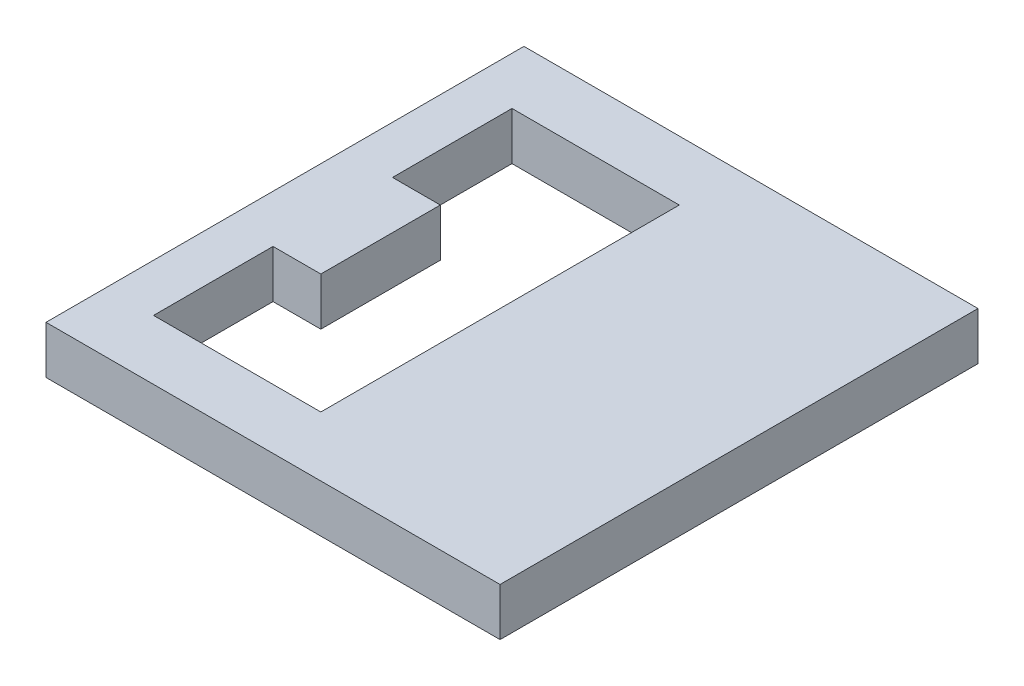
ISO-10303-21;
HEADER;
FILE_DESCRIPTION(('STEP AP214'),'2;1');
FILE_NAME('part.step','',(''),(''),'','','');
FILE_SCHEMA(('AUTOMOTIVE_DESIGN { 1 0 10303 214 1 1 1 1 }'));
ENDSEC;
DATA;
#1=APPLICATION_CONTEXT('core data for automotive mechanical design processes');
#2=APPLICATION_PROTOCOL_DEFINITION('international standard','automotive_design',2000,#1);
#3=PRODUCT_CONTEXT('',#1,'mechanical');
#4=PRODUCT('Part','Part','',(#3));
#5=PRODUCT_RELATED_PRODUCT_CATEGORY('part','',(#4));
#6=PRODUCT_DEFINITION_FORMATION('','',#4);
#7=PRODUCT_DEFINITION_CONTEXT('part definition',#1,'design');
#8=PRODUCT_DEFINITION('design','',#6,#7);
#9=PRODUCT_DEFINITION_SHAPE('','',#8);
#10=(LENGTH_UNIT() NAMED_UNIT(*) SI_UNIT(.MILLI.,.METRE.));
#11=(NAMED_UNIT(*) PLANE_ANGLE_UNIT() SI_UNIT($,.RADIAN.));
#12=(NAMED_UNIT(*) SI_UNIT($,.STERADIAN.) SOLID_ANGLE_UNIT());
#13=UNCERTAINTY_MEASURE_WITH_UNIT(LENGTH_MEASURE(1.E-05),#10,'distance_accuracy_value','');
#14=(GEOMETRIC_REPRESENTATION_CONTEXT(3) GLOBAL_UNCERTAINTY_ASSIGNED_CONTEXT((#13)) GLOBAL_UNIT_ASSIGNED_CONTEXT((#10,
#11,#12)) REPRESENTATION_CONTEXT('',''));
#15=CARTESIAN_POINT('',(0.,0.,0.));
#16=DIRECTION('',(0.,0.,1.));
#17=DIRECTION('',(1.,0.,0.));
#18=AXIS2_PLACEMENT_3D('',#15,#16,#17);
#19=CARTESIAN_POINT('',(0.,2.,0.));
#20=DIRECTION('',(0.,1.,0.));
#21=DIRECTION('',(0.,0.,1.));
#22=AXIS2_PLACEMENT_3D('',#19,#20,#21);
#23=PLANE('',#22);
#24=DIRECTION('',(-1.,0.,0.));
#25=VECTOR('',#24,1.);
#26=CARTESIAN_POINT('',(-2.,2.,-7.49999999999999));
#27=LINE('',#26,#25);
#28=CARTESIAN_POINT('',(5.,2.,-7.49999999999999));
#29=VERTEX_POINT('',#28);
#30=CARTESIAN_POINT('',(-2.,2.,-7.49999999999999));
#31=VERTEX_POINT('',#30);
#32=EDGE_CURVE('E154',#29,#31,#27,.T.);
#33=ORIENTED_EDGE('',*,*,#32,.F.);
#34=DIRECTION('',(0.,0.,-1.));
#35=VECTOR('',#34,1.);
#36=CARTESIAN_POINT('',(5.,2.,7.50000000000001));
#37=LINE('',#36,#35);
#38=CARTESIAN_POINT('',(5.,2.,7.50000000000001));
#39=VERTEX_POINT('',#38);
#40=EDGE_CURVE('E150',#39,#29,#37,.T.);
#41=ORIENTED_EDGE('',*,*,#40,.F.);
#42=DIRECTION('',(1.,0.,0.));
#43=VECTOR('',#42,1.);
#44=CARTESIAN_POINT('',(-2.,2.,7.50000000000001));
#45=LINE('',#44,#43);
#46=CARTESIAN_POINT('',(-2.,2.,7.50000000000001));
#47=VERTEX_POINT('',#46);
#48=EDGE_CURVE('E133',#47,#39,#45,.T.);
#49=ORIENTED_EDGE('',*,*,#48,.F.);
#50=DIRECTION('',(0.,0.,1.));
#51=VECTOR('',#50,1.);
#52=CARTESIAN_POINT('',(-2.,2.,2.50000000000001));
#53=LINE('',#52,#51);
#54=CARTESIAN_POINT('',(-2.,2.,2.50000000000001));
#55=VERTEX_POINT('',#54);
#56=EDGE_CURVE('E143',#55,#47,#53,.T.);
#57=ORIENTED_EDGE('',*,*,#56,.F.);
#58=DIRECTION('',(-1.,0.,0.));
#59=VECTOR('',#58,1.);
#60=CARTESIAN_POINT('',(-2.,2.,2.50000000000001));
#61=LINE('',#60,#59);
#62=CARTESIAN_POINT('',(0.,2.,2.50000000000001));
#63=VERTEX_POINT('',#62);
#64=EDGE_CURVE('E165',#63,#55,#61,.T.);
#65=ORIENTED_EDGE('',*,*,#64,.F.);
#66=DIRECTION('',(0.,0.,1.));
#67=VECTOR('',#66,1.);
#68=CARTESIAN_POINT('',(0.,2.,-7.49999999999999));
#69=LINE('',#68,#67);
#70=CARTESIAN_POINT('',(0.,2.,-2.49999999999999));
#71=VERTEX_POINT('',#70);
#72=EDGE_CURVE('E156',#71,#63,#69,.T.);
#73=ORIENTED_EDGE('',*,*,#72,.F.);
#74=DIRECTION('',(1.,0.,0.));
#75=VECTOR('',#74,1.);
#76=CARTESIAN_POINT('',(-2.,2.,-2.49999999999999));
#77=LINE('',#76,#75);
#78=CARTESIAN_POINT('',(-2.,2.,-2.49999999999999));
#79=VERTEX_POINT('',#78);
#80=EDGE_CURVE('E185',#79,#71,#77,.T.);
#81=ORIENTED_EDGE('',*,*,#80,.F.);
#82=DIRECTION('',(0.,0.,1.));
#83=VECTOR('',#82,1.);
#84=CARTESIAN_POINT('',(-2.,2.,-7.49999999999999));
#85=LINE('',#84,#83);
#86=EDGE_CURVE('E182',#31,#79,#85,.T.);
#87=ORIENTED_EDGE('',*,*,#86,.F.);
#88=EDGE_LOOP('',(#33,#41,#49,#57,#65,#73,#81,#87));
#89=FACE_BOUND('',#88,.T.);
#90=DIRECTION('',(0.,0.,-1.));
#91=VECTOR('',#90,1.);
#92=CARTESIAN_POINT('',(15.,2.,-9.99999999999999));
#93=LINE('',#92,#91);
#94=CARTESIAN_POINT('',(15.,2.,10.));
#95=VERTEX_POINT('',#94);
#96=CARTESIAN_POINT('',(15.,2.,-9.99999999999999));
#97=VERTEX_POINT('',#96);
#98=EDGE_CURVE('E204',#95,#97,#93,.T.);
#99=ORIENTED_EDGE('',*,*,#98,.T.);
#100=DIRECTION('',(-1.,0.,0.));
#101=VECTOR('',#100,1.);
#102=CARTESIAN_POINT('',(-4.,2.,-9.99999999999999));
#103=LINE('',#102,#101);
#104=CARTESIAN_POINT('',(-4.,2.,-9.99999999999999));
#105=VERTEX_POINT('',#104);
#106=EDGE_CURVE('E81',#97,#105,#103,.T.);
#107=ORIENTED_EDGE('',*,*,#106,.T.);
#108=DIRECTION('',(0.,0.,1.));
#109=VECTOR('',#108,1.);
#110=CARTESIAN_POINT('',(-4.,2.,-9.99999999999999));
#111=LINE('',#110,#109);
#112=CARTESIAN_POINT('',(-4.,2.,10.));
#113=VERTEX_POINT('',#112);
#114=EDGE_CURVE('E207',#105,#113,#111,.T.);
#115=ORIENTED_EDGE('',*,*,#114,.T.);
#116=DIRECTION('',(1.,0.,0.));
#117=VECTOR('',#116,1.);
#118=CARTESIAN_POINT('',(-4.,2.,10.));
#119=LINE('',#118,#117);
#120=EDGE_CURVE('E49',#113,#95,#119,.T.);
#121=ORIENTED_EDGE('',*,*,#120,.T.);
#122=EDGE_LOOP('',(#99,#107,#115,#121));
#123=FACE_BOUND('',#122,.T.);
#124=ADVANCED_FACE('F32',(#89,#123),#23,.T.);
#125=CARTESIAN_POINT('',(0.,0.,0.));
#126=DIRECTION('',(0.,1.,0.));
#127=DIRECTION('',(0.,0.,1.));
#128=AXIS2_PLACEMENT_3D('',#125,#126,#127);
#129=PLANE('',#128);
#130=DIRECTION('',(0.,0.,-1.));
#131=VECTOR('',#130,1.);
#132=CARTESIAN_POINT('',(5.,0.,0.));
#133=LINE('',#132,#131);
#134=CARTESIAN_POINT('',(5.,0.,7.50000000000001));
#135=VERTEX_POINT('',#134);
#136=CARTESIAN_POINT('',(5.,0.,-7.49999999999999));
#137=VERTEX_POINT('',#136);
#138=EDGE_CURVE('E11',#135,#137,#133,.T.);
#139=ORIENTED_EDGE('',*,*,#138,.T.);
#140=DIRECTION('',(-1.,0.,0.));
#141=VECTOR('',#140,1.);
#142=CARTESIAN_POINT('',(-2.,0.,-7.49999999999999));
#143=LINE('',#142,#141);
#144=CARTESIAN_POINT('',(-2.,0.,-7.49999999999999));
#145=VERTEX_POINT('',#144);
#146=EDGE_CURVE('E180',#137,#145,#143,.T.);
#147=ORIENTED_EDGE('',*,*,#146,.T.);
#148=DIRECTION('',(0.,0.,1.));
#149=VECTOR('',#148,1.);
#150=CARTESIAN_POINT('',(-2.,0.,-7.49999999999999));
#151=LINE('',#150,#149);
#152=CARTESIAN_POINT('',(-2.,0.,-2.49999999999999));
#153=VERTEX_POINT('',#152);
#154=EDGE_CURVE('E191',#145,#153,#151,.T.);
#155=ORIENTED_EDGE('',*,*,#154,.T.);
#156=DIRECTION('',(1.,0.,0.));
#157=VECTOR('',#156,1.);
#158=CARTESIAN_POINT('',(-2.,0.,-2.49999999999999));
#159=LINE('',#158,#157);
#160=CARTESIAN_POINT('',(0.,0.,-2.49999999999999));
#161=VERTEX_POINT('',#160);
#162=EDGE_CURVE('E183',#153,#161,#159,.T.);
#163=ORIENTED_EDGE('',*,*,#162,.T.);
#164=DIRECTION('',(0.,0.,1.));
#165=VECTOR('',#164,1.);
#166=CARTESIAN_POINT('',(0.,0.,0.));
#167=LINE('',#166,#165);
#168=CARTESIAN_POINT('',(0.,0.,2.50000000000001));
#169=VERTEX_POINT('',#168);
#170=EDGE_CURVE('E160',#161,#169,#167,.T.);
#171=ORIENTED_EDGE('',*,*,#170,.T.);
#172=DIRECTION('',(-1.,0.,0.));
#173=VECTOR('',#172,1.);
#174=CARTESIAN_POINT('',(-2.,0.,2.50000000000001));
#175=LINE('',#174,#173);
#176=CARTESIAN_POINT('',(-2.,0.,2.50000000000001));
#177=VERTEX_POINT('',#176);
#178=EDGE_CURVE('E164',#169,#177,#175,.T.);
#179=ORIENTED_EDGE('',*,*,#178,.T.);
#180=DIRECTION('',(0.,0.,1.));
#181=VECTOR('',#180,1.);
#182=CARTESIAN_POINT('',(-2.,0.,2.50000000000001));
#183=LINE('',#182,#181);
#184=CARTESIAN_POINT('',(-2.,0.,7.50000000000001));
#185=VERTEX_POINT('',#184);
#186=EDGE_CURVE('E171',#177,#185,#183,.T.);
#187=ORIENTED_EDGE('',*,*,#186,.T.);
#188=DIRECTION('',(1.,0.,0.));
#189=VECTOR('',#188,1.);
#190=CARTESIAN_POINT('',(-2.,0.,7.50000000000001));
#191=LINE('',#190,#189);
#192=EDGE_CURVE('E167',#185,#135,#191,.T.);
#193=ORIENTED_EDGE('',*,*,#192,.T.);
#194=EDGE_LOOP('',(#139,#147,#155,#163,#171,#179,#187,#193));
#195=FACE_BOUND('',#194,.T.);
#196=DIRECTION('',(0.,0.,-1.));
#197=VECTOR('',#196,1.);
#198=CARTESIAN_POINT('',(15.,0.,-9.99999999999999));
#199=LINE('',#198,#197);
#200=CARTESIAN_POINT('',(15.,0.,10.));
#201=VERTEX_POINT('',#200);
#202=CARTESIAN_POINT('',(15.,0.,-9.99999999999999));
#203=VERTEX_POINT('',#202);
#204=EDGE_CURVE('E203',#201,#203,#199,.T.);
#205=ORIENTED_EDGE('',*,*,#204,.F.);
#206=DIRECTION('',(1.,0.,0.));
#207=VECTOR('',#206,1.);
#208=CARTESIAN_POINT('',(-4.,0.,10.));
#209=LINE('',#208,#207);
#210=CARTESIAN_POINT('',(-4.,0.,10.));
#211=VERTEX_POINT('',#210);
#212=EDGE_CURVE('E73',#211,#201,#209,.T.);
#213=ORIENTED_EDGE('',*,*,#212,.F.);
#214=DIRECTION('',(0.,0.,1.));
#215=VECTOR('',#214,1.);
#216=CARTESIAN_POINT('',(-4.,0.,-9.99999999999999));
#217=LINE('',#216,#215);
#218=CARTESIAN_POINT('',(-4.,0.,-9.99999999999999));
#219=VERTEX_POINT('',#218);
#220=EDGE_CURVE('E67',#219,#211,#217,.T.);
#221=ORIENTED_EDGE('',*,*,#220,.F.);
#222=DIRECTION('',(-1.,0.,0.));
#223=VECTOR('',#222,1.);
#224=CARTESIAN_POINT('',(-4.,0.,-9.99999999999999));
#225=LINE('',#224,#223);
#226=EDGE_CURVE('E213',#203,#219,#225,.T.);
#227=ORIENTED_EDGE('',*,*,#226,.F.);
#228=EDGE_LOOP('',(#205,#213,#221,#227));
#229=FACE_BOUND('',#228,.T.);
#230=ADVANCED_FACE('F227',(#195,#229),#129,.F.);
#231=CARTESIAN_POINT('',(15.,2.,-9.99999999999999));
#232=DIRECTION('',(-1.,0.,0.));
#233=DIRECTION('',(0.,0.,1.));
#234=AXIS2_PLACEMENT_3D('',#231,#232,#233);
#235=PLANE('',#234);
#236=ORIENTED_EDGE('',*,*,#204,.T.);
#237=DIRECTION('',(0.,-1.,0.));
#238=VECTOR('',#237,1.);
#239=CARTESIAN_POINT('',(15.,2.,-9.99999999999999));
#240=LINE('',#239,#238);
#241=EDGE_CURVE('E41',#97,#203,#240,.T.);
#242=ORIENTED_EDGE('',*,*,#241,.F.);
#243=ORIENTED_EDGE('',*,*,#98,.F.);
#244=DIRECTION('',(0.,-1.,0.));
#245=VECTOR('',#244,1.);
#246=CARTESIAN_POINT('',(15.,2.,10.));
#247=LINE('',#246,#245);
#248=EDGE_CURVE('E210',#95,#201,#247,.T.);
#249=ORIENTED_EDGE('',*,*,#248,.T.);
#250=EDGE_LOOP('',(#236,#242,#243,#249));
#251=FACE_BOUND('',#250,.T.);
#252=ADVANCED_FACE('F34',(#251),#235,.F.);
#253=CARTESIAN_POINT('',(-4.,2.,-9.99999999999999));
#254=DIRECTION('',(0.,0.,1.));
#255=DIRECTION('',(1.,0.,0.));
#256=AXIS2_PLACEMENT_3D('',#253,#254,#255);
#257=PLANE('',#256);
#258=ORIENTED_EDGE('',*,*,#226,.T.);
#259=DIRECTION('',(0.,-1.,0.));
#260=VECTOR('',#259,1.);
#261=CARTESIAN_POINT('',(-4.,2.,-9.99999999999999));
#262=LINE('',#261,#260);
#263=EDGE_CURVE('E220',#105,#219,#262,.T.);
#264=ORIENTED_EDGE('',*,*,#263,.F.);
#265=ORIENTED_EDGE('',*,*,#106,.F.);
#266=ORIENTED_EDGE('',*,*,#241,.T.);
#267=EDGE_LOOP('',(#258,#264,#265,#266));
#268=FACE_BOUND('',#267,.T.);
#269=ADVANCED_FACE('F222',(#268),#257,.F.);
#270=CARTESIAN_POINT('',(-4.,2.,-9.99999999999999));
#271=DIRECTION('',(1.,0.,0.));
#272=DIRECTION('',(0.,0.,-1.));
#273=AXIS2_PLACEMENT_3D('',#270,#271,#272);
#274=PLANE('',#273);
#275=ORIENTED_EDGE('',*,*,#220,.T.);
#276=DIRECTION('',(0.,-1.,0.));
#277=VECTOR('',#276,1.);
#278=CARTESIAN_POINT('',(-4.,2.,10.));
#279=LINE('',#278,#277);
#280=EDGE_CURVE('E218',#113,#211,#279,.T.);
#281=ORIENTED_EDGE('',*,*,#280,.F.);
#282=ORIENTED_EDGE('',*,*,#114,.F.);
#283=ORIENTED_EDGE('',*,*,#263,.T.);
#284=EDGE_LOOP('',(#275,#281,#282,#283));
#285=FACE_BOUND('',#284,.T.);
#286=ADVANCED_FACE('F242',(#285),#274,.F.);
#287=CARTESIAN_POINT('',(-4.,2.,10.));
#288=DIRECTION('',(0.,0.,-1.));
#289=DIRECTION('',(-1.,0.,0.));
#290=AXIS2_PLACEMENT_3D('',#287,#288,#289);
#291=PLANE('',#290);
#292=ORIENTED_EDGE('',*,*,#212,.T.);
#293=ORIENTED_EDGE('',*,*,#248,.F.);
#294=ORIENTED_EDGE('',*,*,#120,.F.);
#295=ORIENTED_EDGE('',*,*,#280,.T.);
#296=EDGE_LOOP('',(#292,#293,#294,#295));
#297=FACE_BOUND('',#296,.T.);
#298=ADVANCED_FACE('F238',(#297),#291,.F.);
#299=CARTESIAN_POINT('',(-2.,2.,-7.49999999999999));
#300=DIRECTION('',(0.,0.,1.));
#301=DIRECTION('',(1.,0.,0.));
#302=AXIS2_PLACEMENT_3D('',#299,#300,#301);
#303=PLANE('',#302);
#304=ORIENTED_EDGE('',*,*,#146,.F.);
#305=DIRECTION('',(0.,1.,0.));
#306=VECTOR('',#305,1.);
#307=CARTESIAN_POINT('',(5.,-8.,-7.49999999999999));
#308=LINE('',#307,#306);
#309=EDGE_CURVE('E151',#137,#29,#308,.T.);
#310=ORIENTED_EDGE('',*,*,#309,.T.);
#311=ORIENTED_EDGE('',*,*,#32,.T.);
#312=DIRECTION('',(0.,-1.,0.));
#313=VECTOR('',#312,1.);
#314=CARTESIAN_POINT('',(-2.,2.,-7.49999999999999));
#315=LINE('',#314,#313);
#316=EDGE_CURVE('E200',#31,#145,#315,.T.);
#317=ORIENTED_EDGE('',*,*,#316,.T.);
#318=EDGE_LOOP('',(#304,#310,#311,#317));
#319=FACE_BOUND('',#318,.T.);
#320=ADVANCED_FACE('F241',(#319),#303,.T.);
#321=CARTESIAN_POINT('',(-2.,2.,-7.49999999999999));
#322=DIRECTION('',(1.,0.,0.));
#323=DIRECTION('',(0.,0.,-1.));
#324=AXIS2_PLACEMENT_3D('',#321,#322,#323);
#325=PLANE('',#324);
#326=ORIENTED_EDGE('',*,*,#154,.F.);
#327=ORIENTED_EDGE('',*,*,#316,.F.);
#328=ORIENTED_EDGE('',*,*,#86,.T.);
#329=DIRECTION('',(0.,-1.,0.));
#330=VECTOR('',#329,1.);
#331=CARTESIAN_POINT('',(-2.,2.,-2.49999999999999));
#332=LINE('',#331,#330);
#333=EDGE_CURVE('E198',#79,#153,#332,.T.);
#334=ORIENTED_EDGE('',*,*,#333,.T.);
#335=EDGE_LOOP('',(#326,#327,#328,#334));
#336=FACE_BOUND('',#335,.T.);
#337=ADVANCED_FACE('F264',(#336),#325,.T.);
#338=CARTESIAN_POINT('',(-2.,2.,-2.49999999999999));
#339=DIRECTION('',(0.,0.,-1.));
#340=DIRECTION('',(-1.,0.,0.));
#341=AXIS2_PLACEMENT_3D('',#338,#339,#340);
#342=PLANE('',#341);
#343=ORIENTED_EDGE('',*,*,#162,.F.);
#344=ORIENTED_EDGE('',*,*,#333,.F.);
#345=ORIENTED_EDGE('',*,*,#80,.T.);
#346=DIRECTION('',(0.,-1.,0.));
#347=VECTOR('',#346,1.);
#348=CARTESIAN_POINT('',(0.,2.,-2.49999999999999));
#349=LINE('',#348,#347);
#350=EDGE_CURVE('E188',#71,#161,#349,.T.);
#351=ORIENTED_EDGE('',*,*,#350,.T.);
#352=EDGE_LOOP('',(#343,#344,#345,#351));
#353=FACE_BOUND('',#352,.T.);
#354=ADVANCED_FACE('F271',(#353),#342,.T.);
#355=CARTESIAN_POINT('',(-2.,2.,2.50000000000001));
#356=DIRECTION('',(0.,0.,1.));
#357=DIRECTION('',(1.,0.,0.));
#358=AXIS2_PLACEMENT_3D('',#355,#356,#357);
#359=PLANE('',#358);
#360=ORIENTED_EDGE('',*,*,#178,.F.);
#361=DIRECTION('',(0.,-1.,0.));
#362=VECTOR('',#361,1.);
#363=CARTESIAN_POINT('',(0.,2.,2.50000000000001));
#364=LINE('',#363,#362);
#365=EDGE_CURVE('E142',#63,#169,#364,.T.);
#366=ORIENTED_EDGE('',*,*,#365,.F.);
#367=ORIENTED_EDGE('',*,*,#64,.T.);
#368=DIRECTION('',(0.,-1.,0.));
#369=VECTOR('',#368,1.);
#370=CARTESIAN_POINT('',(-2.,2.,2.50000000000001));
#371=LINE('',#370,#369);
#372=EDGE_CURVE('E177',#55,#177,#371,.T.);
#373=ORIENTED_EDGE('',*,*,#372,.T.);
#374=EDGE_LOOP('',(#360,#366,#367,#373));
#375=FACE_BOUND('',#374,.T.);
#376=ADVANCED_FACE('F279',(#375),#359,.T.);
#377=CARTESIAN_POINT('',(-2.,2.,2.50000000000001));
#378=DIRECTION('',(1.,0.,0.));
#379=DIRECTION('',(0.,0.,-1.));
#380=AXIS2_PLACEMENT_3D('',#377,#378,#379);
#381=PLANE('',#380);
#382=ORIENTED_EDGE('',*,*,#186,.F.);
#383=ORIENTED_EDGE('',*,*,#372,.F.);
#384=ORIENTED_EDGE('',*,*,#56,.T.);
#385=DIRECTION('',(0.,-1.,0.));
#386=VECTOR('',#385,1.);
#387=CARTESIAN_POINT('',(-2.,2.,7.50000000000001));
#388=LINE('',#387,#386);
#389=EDGE_CURVE('E138',#47,#185,#388,.T.);
#390=ORIENTED_EDGE('',*,*,#389,.T.);
#391=EDGE_LOOP('',(#382,#383,#384,#390));
#392=FACE_BOUND('',#391,.T.);
#393=ADVANCED_FACE('F287',(#392),#381,.T.);
#394=CARTESIAN_POINT('',(-2.,2.,7.50000000000001));
#395=DIRECTION('',(0.,0.,-1.));
#396=DIRECTION('',(-1.,0.,0.));
#397=AXIS2_PLACEMENT_3D('',#394,#395,#396);
#398=PLANE('',#397);
#399=ORIENTED_EDGE('',*,*,#192,.F.);
#400=ORIENTED_EDGE('',*,*,#389,.F.);
#401=ORIENTED_EDGE('',*,*,#48,.T.);
#402=DIRECTION('',(0.,1.,0.));
#403=VECTOR('',#402,1.);
#404=CARTESIAN_POINT('',(5.,-8.,7.50000000000001));
#405=LINE('',#404,#403);
#406=EDGE_CURVE('E137',#135,#39,#405,.T.);
#407=ORIENTED_EDGE('',*,*,#406,.F.);
#408=EDGE_LOOP('',(#399,#400,#401,#407));
#409=FACE_BOUND('',#408,.T.);
#410=ADVANCED_FACE('F136',(#409),#398,.T.);
#411=CARTESIAN_POINT('',(5.,-8.,7.50000000000001));
#412=DIRECTION('',(1.,0.,0.));
#413=DIRECTION('',(0.,0.,-1.));
#414=AXIS2_PLACEMENT_3D('',#411,#412,#413);
#415=PLANE('',#414);
#416=ORIENTED_EDGE('',*,*,#406,.T.);
#417=ORIENTED_EDGE('',*,*,#40,.T.);
#418=ORIENTED_EDGE('',*,*,#309,.F.);
#419=ORIENTED_EDGE('',*,*,#138,.F.);
#420=EDGE_LOOP('',(#416,#417,#418,#419));
#421=FACE_BOUND('',#420,.T.);
#422=ADVANCED_FACE('F148',(#421),#415,.F.);
#423=CARTESIAN_POINT('',(0.,-8.,-7.49999999999999));
#424=DIRECTION('',(-1.,0.,0.));
#425=DIRECTION('',(0.,0.,1.));
#426=AXIS2_PLACEMENT_3D('',#423,#424,#425);
#427=PLANE('',#426);
#428=ORIENTED_EDGE('',*,*,#350,.F.);
#429=ORIENTED_EDGE('',*,*,#72,.T.);
#430=ORIENTED_EDGE('',*,*,#365,.T.);
#431=ORIENTED_EDGE('',*,*,#170,.F.);
#432=EDGE_LOOP('',(#428,#429,#430,#431));
#433=FACE_BOUND('',#432,.T.);
#434=ADVANCED_FACE('F308',(#433),#427,.F.);
#435=CLOSED_SHELL('',(#124,#230,#252,#269,#286,#298,#320,#337,#354,#376,#393,#410,#422,#434));
#436=MANIFOLD_SOLID_BREP('B2',#435);
#437=ADVANCED_BREP_SHAPE_REPRESENTATION('',(#18,#436),#14);
#438=SHAPE_DEFINITION_REPRESENTATION(#9,#437);
ENDSEC;
END-ISO-10303-21;
